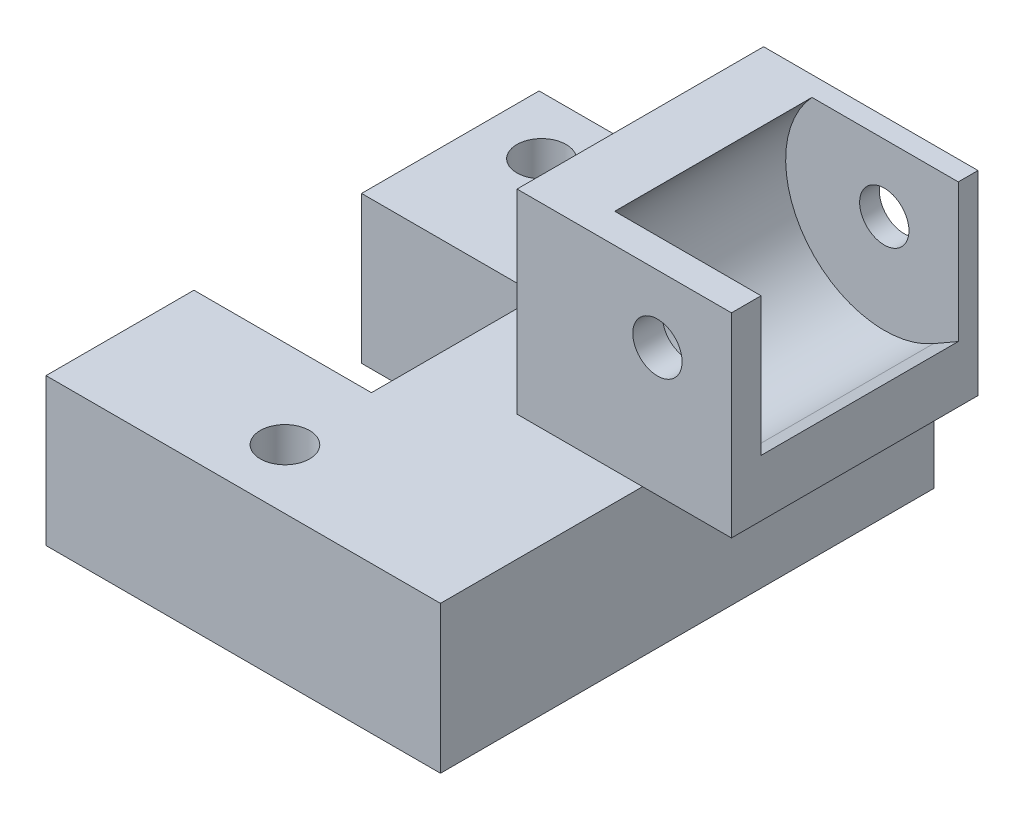
ISO-10303-21;
HEADER;
FILE_DESCRIPTION(('STEP AP214'),'2;1');
FILE_NAME('part.step','',(''),(''),'','','');
FILE_SCHEMA(('AUTOMOTIVE_DESIGN { 1 0 10303 214 1 1 1 1 }'));
ENDSEC;
DATA;
#1=APPLICATION_CONTEXT('core data for automotive mechanical design processes');
#2=APPLICATION_PROTOCOL_DEFINITION('international standard','automotive_design',2000,#1);
#3=PRODUCT_CONTEXT('',#1,'mechanical');
#4=PRODUCT('Part','Part','',(#3));
#5=PRODUCT_RELATED_PRODUCT_CATEGORY('part','',(#4));
#6=PRODUCT_DEFINITION_FORMATION('','',#4);
#7=PRODUCT_DEFINITION_CONTEXT('part definition',#1,'design');
#8=PRODUCT_DEFINITION('design','',#6,#7);
#9=PRODUCT_DEFINITION_SHAPE('','',#8);
#10=(LENGTH_UNIT() NAMED_UNIT(*) SI_UNIT(.MILLI.,.METRE.));
#11=(NAMED_UNIT(*) PLANE_ANGLE_UNIT() SI_UNIT($,.RADIAN.));
#12=(NAMED_UNIT(*) SI_UNIT($,.STERADIAN.) SOLID_ANGLE_UNIT());
#13=UNCERTAINTY_MEASURE_WITH_UNIT(LENGTH_MEASURE(1.E-05),#10,'distance_accuracy_value','');
#14=(GEOMETRIC_REPRESENTATION_CONTEXT(3) GLOBAL_UNCERTAINTY_ASSIGNED_CONTEXT((#13)) GLOBAL_UNIT_ASSIGNED_CONTEXT((#10,
#11,#12)) REPRESENTATION_CONTEXT('',''));
#15=CARTESIAN_POINT('',(0.,0.,0.));
#16=DIRECTION('',(0.,0.,1.));
#17=DIRECTION('',(1.,0.,0.));
#18=AXIS2_PLACEMENT_3D('',#15,#16,#17);
#19=CARTESIAN_POINT('',(-562.359793246241,223.218740039352,-33.6602128680418));
#20=DIRECTION('',(-1.,0.,0.));
#21=DIRECTION('',(0.,-1.,0.));
#22=AXIS2_PLACEMENT_3D('',#19,#20,#21);
#23=PLANE('',#22);
#24=DIRECTION('',(0.,1.,0.));
#25=VECTOR('',#24,1.);
#26=CARTESIAN_POINT('',(-562.359793246241,304.5714,-10.8002128680418));
#27=LINE('',#26,#25);
#28=CARTESIAN_POINT('',(-562.359793246241,304.5714,-10.8002128680418));
#29=VERTEX_POINT('',#28);
#30=CARTESIAN_POINT('',(-562.359793246241,323.525975182462,-10.8002128680418));
#31=VERTEX_POINT('',#30);
#32=EDGE_CURVE('E204',#29,#31,#27,.T.);
#33=ORIENTED_EDGE('',*,*,#32,.T.);
#34=DIRECTION('',(0.,0.,1.));
#35=VECTOR('',#34,1.);
#36=CARTESIAN_POINT('',(-562.359793246241,323.525975182462,-33.6602128680418));
#37=LINE('',#36,#35);
#38=CARTESIAN_POINT('',(-562.359793246241,323.525975182462,-33.6602128680418));
#39=VERTEX_POINT('',#38);
#40=EDGE_CURVE('E360',#39,#31,#37,.T.);
#41=ORIENTED_EDGE('',*,*,#40,.F.);
#42=DIRECTION('',(0.,1.,0.));
#43=VECTOR('',#42,1.);
#44=CARTESIAN_POINT('',(-562.359793246241,223.218740039352,-33.6602128680418));
#45=LINE('',#44,#43);
#46=CARTESIAN_POINT('',(-562.359793246241,304.5714,-33.6602128680418));
#47=VERTEX_POINT('',#46);
#48=EDGE_CURVE('E217',#47,#39,#45,.T.);
#49=ORIENTED_EDGE('',*,*,#48,.F.);
#50=DIRECTION('',(0.,0.,1.));
#51=VECTOR('',#50,1.);
#52=CARTESIAN_POINT('',(-562.359793246241,304.5714,-33.6602128680418));
#53=LINE('',#52,#51);
#54=EDGE_CURVE('E203',#47,#29,#53,.T.);
#55=ORIENTED_EDGE('',*,*,#54,.T.);
#56=EDGE_LOOP('',(#33,#41,#49,#55));
#57=FACE_BOUND('',#56,.T.);
#58=ADVANCED_FACE('F56',(#57),#23,.T.);
#59=CARTESIAN_POINT('',(-509.64503003972,340.,-27.94));
#60=DIRECTION('',(0.,0.,1.));
#61=DIRECTION('',(1.,0.,0.));
#62=AXIS2_PLACEMENT_3D('',#59,#60,#61);
#63=CYLINDRICAL_SURFACE('',#62,12.7);
#64=CARTESIAN_POINT('',(-509.64503003972,340.,-25.4000000000001));
#65=DIRECTION('',(0.,0.,-1.));
#66=DIRECTION('',(-1.,0.,0.));
#67=AXIS2_PLACEMENT_3D('',#64,#65,#66);
#68=CIRCLE('',#67,12.7);
#69=CARTESIAN_POINT('',(-503.315891549761,328.989459324133,-25.4000000000001));
#70=VERTEX_POINT('',#69);
#71=CARTESIAN_POINT('',(-518.959059009132,348.633589309028,-25.4000000000001));
#72=VERTEX_POINT('',#71);
#73=EDGE_CURVE('E264',#70,#72,#68,.T.);
#74=ORIENTED_EDGE('',*,*,#73,.T.);
#75=DIRECTION('',(0.,0.,1.));
#76=VECTOR('',#75,1.);
#77=CARTESIAN_POINT('',(-518.959059009132,348.633589309028,-27.94));
#78=LINE('',#77,#76);
#79=CARTESIAN_POINT('',(-518.959059009132,348.633589309028,0.));
#80=VERTEX_POINT('',#79);
#81=EDGE_CURVE('E60',#72,#80,#78,.T.);
#82=ORIENTED_EDGE('',*,*,#81,.T.);
#83=CARTESIAN_POINT('',(-509.64503003972,340.,0.));
#84=DIRECTION('',(0.,0.,1.));
#85=DIRECTION('',(1.,0.,0.));
#86=AXIS2_PLACEMENT_3D('',#83,#84,#85);
#87=CIRCLE('',#86,12.7);
#88=CARTESIAN_POINT('',(-503.315891549761,328.989459324133,0.));
#89=VERTEX_POINT('',#88);
#90=EDGE_CURVE('E275',#80,#89,#87,.T.);
#91=ORIENTED_EDGE('',*,*,#90,.T.);
#92=DIRECTION('',(0.,0.,1.));
#93=VECTOR('',#92,1.);
#94=CARTESIAN_POINT('',(-503.315891549761,328.989459324133,-27.94));
#95=LINE('',#94,#93);
#96=EDGE_CURVE('E65',#70,#89,#95,.T.);
#97=ORIENTED_EDGE('',*,*,#96,.F.);
#98=EDGE_LOOP('',(#74,#82,#91,#97));
#99=FACE_BOUND('',#98,.T.);
#100=ADVANCED_FACE('F58',(#99),#63,.F.);
#101=CARTESIAN_POINT('',(-267.1473205328,464.745153521614,-27.94));
#102=DIRECTION('',(-0.498357361414056,0.866971706761195,0.));
#103=DIRECTION('',(-0.866971706761195,-0.498357361414056,0.));
#104=AXIS2_PLACEMENT_3D('',#101,#102,#103);
#105=PLANE('',#104);
#106=DIRECTION('',(0.,0.,1.));
#107=VECTOR('',#106,1.);
#108=CARTESIAN_POINT('',(-500.115803520306,330.82895121783,-27.94));
#109=LINE('',#108,#107);
#110=CARTESIAN_POINT('',(-500.115803520306,330.82895121783,-25.4000000000001));
#111=VERTEX_POINT('',#110);
#112=CARTESIAN_POINT('',(-500.115803520306,330.82895121783,0.));
#113=VERTEX_POINT('',#112);
#114=EDGE_CURVE('E293',#111,#113,#109,.T.);
#115=ORIENTED_EDGE('',*,*,#114,.F.);
#116=DIRECTION('',(-0.866971706761204,-0.498357361414042,0.));
#117=VECTOR('',#116,1.);
#118=CARTESIAN_POINT('',(-500.115803520306,330.82895121783,-25.4000000000001));
#119=LINE('',#118,#117);
#120=EDGE_CURVE('E267',#111,#70,#119,.T.);
#121=ORIENTED_EDGE('',*,*,#120,.T.);
#122=ORIENTED_EDGE('',*,*,#96,.T.);
#123=DIRECTION('',(-0.866971706761195,-0.498357361414056,0.));
#124=VECTOR('',#123,1.);
#125=CARTESIAN_POINT('',(-267.1473205328,464.745153521614,0.));
#126=LINE('',#125,#124);
#127=EDGE_CURVE('E280',#113,#89,#126,.T.);
#128=ORIENTED_EDGE('',*,*,#127,.F.);
#129=EDGE_LOOP('',(#115,#121,#122,#128));
#130=FACE_BOUND('',#129,.T.);
#131=ADVANCED_FACE('F321',(#130),#105,.T.);
#132=CARTESIAN_POINT('',(-500.115803520306,0.,-27.94));
#133=DIRECTION('',(-1.,0.,0.));
#134=DIRECTION('',(0.,0.,1.));
#135=AXIS2_PLACEMENT_3D('',#132,#133,#134);
#136=PLANE('',#135);
#137=ORIENTED_EDGE('',*,*,#114,.T.);
#138=DIRECTION('',(0.,-1.,0.));
#139=VECTOR('',#138,1.);
#140=CARTESIAN_POINT('',(-500.115803520306,348.633589309028,0.));
#141=LINE('',#140,#139);
#142=CARTESIAN_POINT('',(-500.115803520306,348.633589309028,0.));
#143=VERTEX_POINT('',#142);
#144=EDGE_CURVE('E251',#143,#113,#141,.T.);
#145=ORIENTED_EDGE('',*,*,#144,.F.);
#146=DIRECTION('',(0.,0.,-1.));
#147=VECTOR('',#146,1.);
#148=CARTESIAN_POINT('',(-500.115803520306,348.633589309028,3.81));
#149=LINE('',#148,#147);
#150=CARTESIAN_POINT('',(-500.115803520306,348.633589309028,3.81));
#151=VERTEX_POINT('',#150);
#152=EDGE_CURVE('E249',#151,#143,#149,.T.);
#153=ORIENTED_EDGE('',*,*,#152,.F.);
#154=DIRECTION('',(0.,-1.,0.));
#155=VECTOR('',#154,1.);
#156=CARTESIAN_POINT('',(-500.115803520306,348.633589309028,3.81));
#157=LINE('',#156,#155);
#158=CARTESIAN_POINT('',(-500.115803520306,323.525975182462,3.81));
#159=VERTEX_POINT('',#158);
#160=EDGE_CURVE('E246',#151,#159,#157,.T.);
#161=ORIENTED_EDGE('',*,*,#160,.T.);
#162=DIRECTION('',(0.,0.,1.));
#163=VECTOR('',#162,1.);
#164=CARTESIAN_POINT('',(-500.115803520306,323.525975182462,-27.94));
#165=LINE('',#164,#163);
#166=CARTESIAN_POINT('',(-500.115803520306,323.525975182462,-27.94));
#167=VERTEX_POINT('',#166);
#168=EDGE_CURVE('E295',#167,#159,#165,.T.);
#169=ORIENTED_EDGE('',*,*,#168,.F.);
#170=DIRECTION('',(0.,-1.,0.));
#171=VECTOR('',#170,1.);
#172=CARTESIAN_POINT('',(-500.115803520306,0.,-27.94));
#173=LINE('',#172,#171);
#174=CARTESIAN_POINT('',(-500.115803520306,348.633589309028,-27.94));
#175=VERTEX_POINT('',#174);
#176=EDGE_CURVE('E286',#175,#167,#173,.T.);
#177=ORIENTED_EDGE('',*,*,#176,.F.);
#178=DIRECTION('',(0.,0.,1.));
#179=VECTOR('',#178,1.);
#180=CARTESIAN_POINT('',(-500.115803520306,348.633589309028,-58.7500721267847));
#181=LINE('',#180,#179);
#182=CARTESIAN_POINT('',(-500.115803520306,348.633589309028,-25.4000000000001));
#183=VERTEX_POINT('',#182);
#184=EDGE_CURVE('E260',#175,#183,#181,.T.);
#185=ORIENTED_EDGE('',*,*,#184,.T.);
#186=DIRECTION('',(0.,-1.,0.));
#187=VECTOR('',#186,1.);
#188=CARTESIAN_POINT('',(-500.115803520306,330.82895121783,-25.4000000000001));
#189=LINE('',#188,#187);
#190=EDGE_CURVE('E257',#183,#111,#189,.T.);
#191=ORIENTED_EDGE('',*,*,#190,.T.);
#192=EDGE_LOOP('',(#137,#145,#153,#161,#169,#177,#185,#191));
#193=FACE_BOUND('',#192,.T.);
#194=ADVANCED_FACE('F316',(#193),#136,.F.);
#195=CARTESIAN_POINT('',(0.,323.525975182462,-27.94));
#196=DIRECTION('',(0.,1.,0.));
#197=DIRECTION('',(0.,0.,1.));
#198=AXIS2_PLACEMENT_3D('',#195,#196,#197);
#199=PLANE('',#198);
#200=DIRECTION('',(-1.,0.,0.));
#201=VECTOR('',#200,1.);
#202=CARTESIAN_POINT('',(-500.115803520306,323.525975182462,3.81));
#203=LINE('',#202,#201);
#204=CARTESIAN_POINT('',(-511.559800437477,323.525975182462,3.81000000000003));
#205=VERTEX_POINT('',#204);
#206=EDGE_CURVE('E236',#159,#205,#203,.T.);
#207=ORIENTED_EDGE('',*,*,#206,.T.);
#208=DIRECTION('',(-2.76269463312672E-07,0.,-0.999999999999962));
#209=VECTOR('',#208,1.);
#210=CARTESIAN_POINT('',(-511.55981080102,323.525975182462,-33.7024451444806));
#211=LINE('',#210,#209);
#212=CARTESIAN_POINT('',(-511.559809209032,323.525975182462,-27.94));
#213=VERTEX_POINT('',#212);
#214=EDGE_CURVE('E12',#205,#213,#211,.T.);
#215=ORIENTED_EDGE('',*,*,#214,.T.);
#216=DIRECTION('',(-1.,0.,0.));
#217=VECTOR('',#216,1.);
#218=CARTESIAN_POINT('',(0.,323.525975182462,-27.94));
#219=LINE('',#218,#217);
#220=EDGE_CURVE('E283',#167,#213,#219,.T.);
#221=ORIENTED_EDGE('',*,*,#220,.F.);
#222=ORIENTED_EDGE('',*,*,#168,.T.);
#223=EDGE_LOOP('',(#207,#215,#221,#222));
#224=FACE_BOUND('',#223,.T.);
#225=ADVANCED_FACE('F342',(#224),#199,.F.);
#226=CARTESIAN_POINT('',(-527.727560082314,0.,-27.94));
#227=DIRECTION('',(1.,0.,0.));
#228=DIRECTION('',(0.,0.,-1.));
#229=AXIS2_PLACEMENT_3D('',#226,#227,#228);
#230=PLANE('',#229);
#231=DIRECTION('',(0.,0.,1.));
#232=VECTOR('',#231,1.);
#233=CARTESIAN_POINT('',(-527.727560082314,323.525975182462,-27.94));
#234=LINE('',#233,#232);
#235=CARTESIAN_POINT('',(-527.727560082314,323.525975182462,-27.94));
#236=VERTEX_POINT('',#235);
#237=CARTESIAN_POINT('',(-527.727560082314,323.525975182462,3.81));
#238=VERTEX_POINT('',#237);
#239=EDGE_CURVE('E297',#236,#238,#234,.T.);
#240=ORIENTED_EDGE('',*,*,#239,.T.);
#241=DIRECTION('',(0.,1.,0.));
#242=VECTOR('',#241,1.);
#243=CARTESIAN_POINT('',(-527.727560082314,323.525975182462,3.81));
#244=LINE('',#243,#242);
#245=CARTESIAN_POINT('',(-527.727560082314,348.633589309028,3.81));
#246=VERTEX_POINT('',#245);
#247=EDGE_CURVE('E239',#238,#246,#244,.T.);
#248=ORIENTED_EDGE('',*,*,#247,.T.);
#249=DIRECTION('',(0.,0.,1.));
#250=VECTOR('',#249,1.);
#251=CARTESIAN_POINT('',(-527.727560082314,348.633589309028,-27.94));
#252=LINE('',#251,#250);
#253=CARTESIAN_POINT('',(-527.727560082314,348.633589309028,-27.94));
#254=VERTEX_POINT('',#253);
#255=EDGE_CURVE('E299',#254,#246,#252,.T.);
#256=ORIENTED_EDGE('',*,*,#255,.F.);
#257=DIRECTION('',(0.,1.,0.));
#258=VECTOR('',#257,1.);
#259=CARTESIAN_POINT('',(-527.727560082314,0.,-27.94));
#260=LINE('',#259,#258);
#261=EDGE_CURVE('E279',#236,#254,#260,.T.);
#262=ORIENTED_EDGE('',*,*,#261,.F.);
#263=EDGE_LOOP('',(#240,#248,#256,#262));
#264=FACE_BOUND('',#263,.T.);
#265=ADVANCED_FACE('F334',(#264),#230,.F.);
#266=CARTESIAN_POINT('',(-7.00898976020188E-13,348.633589309029,-27.94));
#267=DIRECTION('',(0.,-1.,0.));
#268=DIRECTION('',(1.,0.,0.));
#269=AXIS2_PLACEMENT_3D('',#266,#267,#268);
#270=PLANE('',#269);
#271=ORIENTED_EDGE('',*,*,#255,.T.);
#272=DIRECTION('',(1.,0.,0.));
#273=VECTOR('',#272,1.);
#274=CARTESIAN_POINT('',(-527.727560082314,348.633589309028,3.81));
#275=LINE('',#274,#273);
#276=EDGE_CURVE('E243',#246,#151,#275,.T.);
#277=ORIENTED_EDGE('',*,*,#276,.T.);
#278=ORIENTED_EDGE('',*,*,#152,.T.);
#279=DIRECTION('',(1.,0.,0.));
#280=VECTOR('',#279,1.);
#281=CARTESIAN_POINT('',(-527.727560082314,348.633589309028,0.));
#282=LINE('',#281,#280);
#283=EDGE_CURVE('E231',#80,#143,#282,.T.);
#284=ORIENTED_EDGE('',*,*,#283,.F.);
#285=ORIENTED_EDGE('',*,*,#81,.F.);
#286=DIRECTION('',(1.,0.,0.));
#287=VECTOR('',#286,1.);
#288=CARTESIAN_POINT('',(-500.115803520306,348.633589309028,-25.4000000000001));
#289=LINE('',#288,#287);
#290=EDGE_CURVE('E261',#72,#183,#289,.T.);
#291=ORIENTED_EDGE('',*,*,#290,.T.);
#292=ORIENTED_EDGE('',*,*,#184,.F.);
#293=DIRECTION('',(1.,0.,0.));
#294=VECTOR('',#293,1.);
#295=CARTESIAN_POINT('',(-7.00898976020188E-13,348.633589309029,-27.94));
#296=LINE('',#295,#294);
#297=EDGE_CURVE('E276',#254,#175,#296,.T.);
#298=ORIENTED_EDGE('',*,*,#297,.F.);
#299=EDGE_LOOP('',(#271,#277,#278,#284,#285,#291,#292,#298));
#300=FACE_BOUND('',#299,.T.);
#301=ADVANCED_FACE('F312',(#300),#270,.F.);
#302=CARTESIAN_POINT('',(0.,0.,-27.94));
#303=DIRECTION('',(0.,0.,1.));
#304=DIRECTION('',(1.,0.,0.));
#305=AXIS2_PLACEMENT_3D('',#302,#303,#304);
#306=PLANE('',#305);
#307=ORIENTED_EDGE('',*,*,#297,.T.);
#308=ORIENTED_EDGE('',*,*,#176,.T.);
#309=ORIENTED_EDGE('',*,*,#220,.T.);
#310=EDGE_CURVE('E282',#213,#236,#219,.T.);
#311=ORIENTED_EDGE('',*,*,#310,.T.);
#312=ORIENTED_EDGE('',*,*,#261,.T.);
#313=EDGE_LOOP('',(#307,#308,#309,#311,#312));
#314=FACE_BOUND('',#313,.T.);
#315=CARTESIAN_POINT('',(-509.64503003972,340.,-27.94));
#316=DIRECTION('',(0.,0.,1.));
#317=DIRECTION('',(1.,0.,0.));
#318=AXIS2_PLACEMENT_3D('',#315,#316,#317);
#319=CIRCLE('',#318,3.1750000000002);
#320=CARTESIAN_POINT('',(-506.47003003972,340.,-27.94));
#321=VERTEX_POINT('',#320);
#322=EDGE_CURVE('E259',#321,#321,#319,.T.);
#323=ORIENTED_EDGE('',*,*,#322,.T.);
#324=EDGE_LOOP('',(#323));
#325=FACE_BOUND('',#324,.T.);
#326=ADVANCED_FACE('F329',(#314,#325),#306,.F.);
#327=CARTESIAN_POINT('',(-509.64503003972,340.,-25.4000000000001));
#328=DIRECTION('',(0.,0.,-1.));
#329=DIRECTION('',(-1.,0.,0.));
#330=AXIS2_PLACEMENT_3D('',#327,#328,#329);
#331=PLANE('',#330);
#332=ORIENTED_EDGE('',*,*,#120,.F.);
#333=ORIENTED_EDGE('',*,*,#190,.F.);
#334=ORIENTED_EDGE('',*,*,#290,.F.);
#335=ORIENTED_EDGE('',*,*,#73,.F.);
#336=EDGE_LOOP('',(#332,#333,#334,#335));
#337=FACE_BOUND('',#336,.T.);
#338=CARTESIAN_POINT('',(-509.64503003972,340.,-25.4000000000001));
#339=DIRECTION('',(0.,0.,-1.));
#340=DIRECTION('',(-1.,0.,0.));
#341=AXIS2_PLACEMENT_3D('',#338,#339,#340);
#342=CIRCLE('',#341,3.1750000000002);
#343=CARTESIAN_POINT('',(-512.82003003972,340.,-25.4000000000001));
#344=VERTEX_POINT('',#343);
#345=EDGE_CURVE('E256',#344,#344,#342,.T.);
#346=ORIENTED_EDGE('',*,*,#345,.T.);
#347=EDGE_LOOP('',(#346));
#348=FACE_BOUND('',#347,.T.);
#349=ADVANCED_FACE('F323',(#337,#348),#331,.F.);
#350=CARTESIAN_POINT('',(-509.64503003972,340.,-58.7500721267847));
#351=DIRECTION('',(0.,0.,1.));
#352=DIRECTION('',(1.,0.,0.));
#353=AXIS2_PLACEMENT_3D('',#350,#351,#352);
#354=CYLINDRICAL_SURFACE('',#353,3.1750000000002);
#355=ORIENTED_EDGE('',*,*,#322,.F.);
#356=EDGE_LOOP('',(#355));
#357=FACE_BOUND('',#356,.T.);
#358=ORIENTED_EDGE('',*,*,#345,.F.);
#359=EDGE_LOOP('',(#358));
#360=FACE_BOUND('',#359,.T.);
#361=ADVANCED_FACE('F413',(#357,#360),#354,.F.);
#362=CARTESIAN_POINT('',(0.,0.,0.));
#363=DIRECTION('',(0.,0.,-1.));
#364=DIRECTION('',(-1.,0.,0.));
#365=AXIS2_PLACEMENT_3D('',#362,#363,#364);
#366=PLANE('',#365);
#367=CARTESIAN_POINT('',(-509.64503003972,340.,0.));
#368=DIRECTION('',(0.,0.,1.));
#369=DIRECTION('',(1.,0.,0.));
#370=AXIS2_PLACEMENT_3D('',#367,#368,#369);
#371=CIRCLE('',#370,3.17500000000009);
#372=CARTESIAN_POINT('',(-506.47003003972,340.,0.));
#373=VERTEX_POINT('',#372);
#374=EDGE_CURVE('E232',#373,#373,#371,.T.);
#375=ORIENTED_EDGE('',*,*,#374,.T.);
#376=EDGE_LOOP('',(#375));
#377=FACE_BOUND('',#376,.T.);
#378=ORIENTED_EDGE('',*,*,#90,.F.);
#379=ORIENTED_EDGE('',*,*,#283,.T.);
#380=ORIENTED_EDGE('',*,*,#144,.T.);
#381=ORIENTED_EDGE('',*,*,#127,.T.);
#382=EDGE_LOOP('',(#378,#379,#380,#381));
#383=FACE_BOUND('',#382,.T.);
#384=ADVANCED_FACE('F310',(#377,#383),#366,.T.);
#385=CARTESIAN_POINT('',(0.,0.,3.81));
#386=DIRECTION('',(0.,0.,-1.));
#387=DIRECTION('',(-1.,0.,0.));
#388=AXIS2_PLACEMENT_3D('',#385,#386,#387);
#389=PLANE('',#388);
#390=ORIENTED_EDGE('',*,*,#206,.F.);
#391=ORIENTED_EDGE('',*,*,#160,.F.);
#392=ORIENTED_EDGE('',*,*,#276,.F.);
#393=ORIENTED_EDGE('',*,*,#247,.F.);
#394=EDGE_CURVE('E240',#205,#238,#203,.T.);
#395=ORIENTED_EDGE('',*,*,#394,.F.);
#396=EDGE_LOOP('',(#390,#391,#392,#393,#395));
#397=FACE_BOUND('',#396,.T.);
#398=CARTESIAN_POINT('',(-509.64503003972,340.,3.81));
#399=DIRECTION('',(0.,0.,1.));
#400=DIRECTION('',(1.,0.,0.));
#401=AXIS2_PLACEMENT_3D('',#398,#399,#400);
#402=CIRCLE('',#401,3.17500000000009);
#403=CARTESIAN_POINT('',(-506.47003003972,340.,3.81));
#404=VERTEX_POINT('',#403);
#405=EDGE_CURVE('E228',#404,#404,#402,.T.);
#406=ORIENTED_EDGE('',*,*,#405,.F.);
#407=EDGE_LOOP('',(#406));
#408=FACE_BOUND('',#407,.T.);
#409=ADVANCED_FACE('F339',(#397,#408),#389,.F.);
#410=CARTESIAN_POINT('',(-509.64503003972,340.,3.81));
#411=DIRECTION('',(0.,0.,-1.));
#412=DIRECTION('',(-1.,0.,0.));
#413=AXIS2_PLACEMENT_3D('',#410,#411,#412);
#414=CYLINDRICAL_SURFACE('',#413,3.17500000000009);
#415=ORIENTED_EDGE('',*,*,#405,.T.);
#416=EDGE_LOOP('',(#415));
#417=FACE_BOUND('',#416,.T.);
#418=ORIENTED_EDGE('',*,*,#374,.F.);
#419=EDGE_LOOP('',(#418));
#420=FACE_BOUND('',#419,.T.);
#421=ADVANCED_FACE('F396',(#417,#420),#414,.F.);
#422=DIRECTION('',(0.,1.,0.));
#423=VECTOR('',#422,1.);
#424=CARTESIAN_POINT('',(-562.359793246241,304.5714,10.7897871319582));
#425=LINE('',#424,#423);
#426=CARTESIAN_POINT('',(-562.359793246241,304.5714,10.7897871319582));
#427=VERTEX_POINT('',#426);
#428=CARTESIAN_POINT('',(-562.359793246241,323.525975182462,10.7897871319582));
#429=VERTEX_POINT('',#428);
#430=EDGE_CURVE('E181',#427,#429,#425,.T.);
#431=ORIENTED_EDGE('',*,*,#430,.F.);
#432=CARTESIAN_POINT('',(-562.359793246241,304.5714,29.8397871319582));
#433=VERTEX_POINT('',#432);
#434=EDGE_CURVE('E192',#427,#433,#53,.T.);
#435=ORIENTED_EDGE('',*,*,#434,.T.);
#436=DIRECTION('',(0.,1.,0.));
#437=VECTOR('',#436,1.);
#438=CARTESIAN_POINT('',(-562.359793246241,223.218740039352,29.8397871319582));
#439=LINE('',#438,#437);
#440=CARTESIAN_POINT('',(-562.359793246241,323.525975182462,29.8397871319582));
#441=VERTEX_POINT('',#440);
#442=EDGE_CURVE('E207',#433,#441,#439,.T.);
#443=ORIENTED_EDGE('',*,*,#442,.T.);
#444=EDGE_CURVE('E194',#429,#441,#37,.T.);
#445=ORIENTED_EDGE('',*,*,#444,.F.);
#446=EDGE_LOOP('',(#431,#435,#443,#445));
#447=FACE_BOUND('',#446,.T.);
#448=ADVANCED_FACE('F190',(#447),#23,.T.);
#449=CARTESIAN_POINT('',(-562.359793246241,223.218740039352,-33.6602128680418));
#450=DIRECTION('',(-0.000831344024384845,0.,-0.999999654433497));
#451=DIRECTION('',(-0.999999654433497,0.,0.000831344024384845));
#452=AXIS2_PLACEMENT_3D('',#449,#450,#451);
#453=PLANE('',#452);
#454=DIRECTION('',(0.,1.,0.));
#455=VECTOR('',#454,1.);
#456=CARTESIAN_POINT('',(-511.55981080102,223.218740039352,-33.7024451444805));
#457=LINE('',#456,#455);
#458=CARTESIAN_POINT('',(-511.55981080102,304.5714,-33.7024451444806));
#459=VERTEX_POINT('',#458);
#460=CARTESIAN_POINT('',(-511.55981080102,323.525975182462,-33.7024451444806));
#461=VERTEX_POINT('',#460);
#462=EDGE_CURVE('E221',#459,#461,#457,.T.);
#463=ORIENTED_EDGE('',*,*,#462,.F.);
#464=DIRECTION('',(-0.999999654433497,0.,0.000831344024384845));
#465=VECTOR('',#464,1.);
#466=CARTESIAN_POINT('',(-562.359793246241,304.5714,-33.6602128680418));
#467=LINE('',#466,#465);
#468=EDGE_CURVE('E214',#459,#47,#467,.T.);
#469=ORIENTED_EDGE('',*,*,#468,.T.);
#470=ORIENTED_EDGE('',*,*,#48,.T.);
#471=DIRECTION('',(-0.999999654433497,0.,0.000831344024384845));
#472=VECTOR('',#471,1.);
#473=CARTESIAN_POINT('',(-562.359793246241,323.525975182462,-33.6602128680418));
#474=LINE('',#473,#472);
#475=EDGE_CURVE('E354',#461,#39,#474,.T.);
#476=ORIENTED_EDGE('',*,*,#475,.F.);
#477=EDGE_LOOP('',(#463,#469,#470,#476));
#478=FACE_BOUND('',#477,.T.);
#479=ADVANCED_FACE('F395',(#478),#453,.T.);
#480=CARTESIAN_POINT('',(-511.55981080102,223.218740039352,-33.7024451444805));
#481=DIRECTION('',(0.999999999999962,0.,-2.76269463312672E-07));
#482=DIRECTION('',(-2.76269463312672E-07,0.,-0.999999999999962));
#483=AXIS2_PLACEMENT_3D('',#480,#481,#482);
#484=PLANE('',#483);
#485=DIRECTION('',(0.,1.,0.));
#486=VECTOR('',#485,1.);
#487=CARTESIAN_POINT('',(-511.559793246241,223.218740039352,29.8397871319582));
#488=LINE('',#487,#486);
#489=CARTESIAN_POINT('',(-511.559793246241,304.5714,29.8397871319582));
#490=VERTEX_POINT('',#489);
#491=CARTESIAN_POINT('',(-511.559793246241,323.525975182462,29.8397871319582));
#492=VERTEX_POINT('',#491);
#493=EDGE_CURVE('E224',#490,#492,#488,.T.);
#494=ORIENTED_EDGE('',*,*,#493,.F.);
#495=DIRECTION('',(-2.76269463312672E-07,0.,-0.999999999999962));
#496=VECTOR('',#495,1.);
#497=CARTESIAN_POINT('',(-511.55981080102,304.5714,-33.7024451444806));
#498=LINE('',#497,#496);
#499=EDGE_CURVE('E218',#490,#459,#498,.T.);
#500=ORIENTED_EDGE('',*,*,#499,.T.);
#501=ORIENTED_EDGE('',*,*,#462,.T.);
#502=EDGE_CURVE('E68',#213,#461,#211,.T.);
#503=ORIENTED_EDGE('',*,*,#502,.F.);
#504=ORIENTED_EDGE('',*,*,#214,.F.);
#505=EDGE_CURVE('E67',#492,#205,#211,.T.);
#506=ORIENTED_EDGE('',*,*,#505,.F.);
#507=EDGE_LOOP('',(#494,#500,#501,#503,#504,#506));
#508=FACE_BOUND('',#507,.T.);
#509=ADVANCED_FACE('F346',(#508),#484,.T.);
#510=CARTESIAN_POINT('',(-562.359793246241,223.218740039352,29.8397871319582));
#511=DIRECTION('',(0.,0.,1.));
#512=DIRECTION('',(0.,-1.,0.));
#513=AXIS2_PLACEMENT_3D('',#510,#511,#512);
#514=PLANE('',#513);
#515=ORIENTED_EDGE('',*,*,#442,.F.);
#516=DIRECTION('',(1.,0.,0.));
#517=VECTOR('',#516,1.);
#518=CARTESIAN_POINT('',(-562.359793246241,304.5714,29.8397871319582));
#519=LINE('',#518,#517);
#520=EDGE_CURVE('E201',#433,#490,#519,.T.);
#521=ORIENTED_EDGE('',*,*,#520,.T.);
#522=ORIENTED_EDGE('',*,*,#493,.T.);
#523=DIRECTION('',(1.,0.,0.));
#524=VECTOR('',#523,1.);
#525=CARTESIAN_POINT('',(-562.359793246241,323.525975182462,29.8397871319582));
#526=LINE('',#525,#524);
#527=EDGE_CURVE('E353',#441,#492,#526,.T.);
#528=ORIENTED_EDGE('',*,*,#527,.F.);
#529=EDGE_LOOP('',(#515,#521,#522,#528));
#530=FACE_BOUND('',#529,.T.);
#531=ADVANCED_FACE('F384',(#530),#514,.T.);
#532=CARTESIAN_POINT('',(-539.269132339574,223.218740039352,22.1596399352954));
#533=DIRECTION('',(0.,1.,0.));
#534=DIRECTION('',(0.,0.,1.));
#535=AXIS2_PLACEMENT_3D('',#532,#533,#534);
#536=CYLINDRICAL_SURFACE('',#535,3.17500000000008);
#537=CARTESIAN_POINT('',(-539.269132339574,323.525975182462,22.1596399352954));
#538=DIRECTION('',(0.,1.,0.));
#539=DIRECTION('',(0.,0.,1.));
#540=AXIS2_PLACEMENT_3D('',#537,#538,#539);
#541=CIRCLE('',#540,3.17500000000008);
#542=CARTESIAN_POINT('',(-539.269132339574,323.525975182462,25.3346399352955));
#543=VERTEX_POINT('',#542);
#544=EDGE_CURVE('E226',#543,#543,#541,.T.);
#545=ORIENTED_EDGE('',*,*,#544,.T.);
#546=EDGE_LOOP('',(#545));
#547=FACE_BOUND('',#546,.T.);
#548=CARTESIAN_POINT('',(-539.269132339574,304.5714,22.1596399352954));
#549=DIRECTION('',(0.,-1.,0.));
#550=DIRECTION('',(0.,0.,-1.));
#551=AXIS2_PLACEMENT_3D('',#548,#549,#550);
#552=CIRCLE('',#551,3.17500000000008);
#553=CARTESIAN_POINT('',(-539.269132339574,304.5714,18.9846399352953));
#554=VERTEX_POINT('',#553);
#555=EDGE_CURVE('E235',#554,#554,#552,.F.);
#556=ORIENTED_EDGE('',*,*,#555,.F.);
#557=EDGE_LOOP('',(#556));
#558=FACE_BOUND('',#557,.T.);
#559=ADVANCED_FACE('F375',(#547,#558),#536,.F.);
#560=CARTESIAN_POINT('',(-554.645069673997,223.218740039352,-26.2575114791356));
#561=DIRECTION('',(0.,1.,0.));
#562=DIRECTION('',(0.,0.,1.));
#563=AXIS2_PLACEMENT_3D('',#560,#561,#562);
#564=CYLINDRICAL_SURFACE('',#563,3.17500000000008);
#565=CARTESIAN_POINT('',(-554.645069673997,323.525975182462,-26.2575114791357));
#566=DIRECTION('',(0.,1.,0.));
#567=DIRECTION('',(0.,0.,1.));
#568=AXIS2_PLACEMENT_3D('',#565,#566,#567);
#569=CIRCLE('',#568,3.17500000000008);
#570=CARTESIAN_POINT('',(-554.645069673997,323.525975182462,-23.0825114791356));
#571=VERTEX_POINT('',#570);
#572=EDGE_CURVE('E365',#571,#571,#569,.T.);
#573=ORIENTED_EDGE('',*,*,#572,.T.);
#574=EDGE_LOOP('',(#573));
#575=FACE_BOUND('',#574,.T.);
#576=CARTESIAN_POINT('',(-554.645069673997,304.5714,-26.2575114791357));
#577=DIRECTION('',(0.,-1.,0.));
#578=DIRECTION('',(0.,0.,-1.));
#579=AXIS2_PLACEMENT_3D('',#576,#577,#578);
#580=CIRCLE('',#579,3.17500000000008);
#581=CARTESIAN_POINT('',(-554.645069673997,304.5714,-29.4325114791357));
#582=VERTEX_POINT('',#581);
#583=EDGE_CURVE('E356',#582,#582,#580,.F.);
#584=ORIENTED_EDGE('',*,*,#583,.F.);
#585=EDGE_LOOP('',(#584));
#586=FACE_BOUND('',#585,.T.);
#587=ADVANCED_FACE('F373',(#575,#586),#564,.F.);
#588=CARTESIAN_POINT('',(0.,323.525975182462,0.));
#589=DIRECTION('',(0.,1.,0.));
#590=DIRECTION('',(0.,0.,1.));
#591=AXIS2_PLACEMENT_3D('',#588,#589,#590);
#592=PLANE('',#591);
#593=DIRECTION('',(-1.,0.,0.));
#594=VECTOR('',#593,1.);
#595=CARTESIAN_POINT('',(-562.359793246241,323.525975182462,-10.8002128680418));
#596=LINE('',#595,#594);
#597=CARTESIAN_POINT('',(-539.499793246241,323.525975182462,-10.8002128680418));
#598=VERTEX_POINT('',#597);
#599=EDGE_CURVE('E186',#598,#31,#596,.T.);
#600=ORIENTED_EDGE('',*,*,#599,.F.);
#601=DIRECTION('',(0.,0.,-1.));
#602=VECTOR('',#601,1.);
#603=CARTESIAN_POINT('',(-539.499793246241,323.525975182462,-10.8002128680418));
#604=LINE('',#603,#602);
#605=CARTESIAN_POINT('',(-539.499793246241,323.525975182462,10.7897871319582));
#606=VERTEX_POINT('',#605);
#607=EDGE_CURVE('E537',#606,#598,#604,.T.);
#608=ORIENTED_EDGE('',*,*,#607,.F.);
#609=DIRECTION('',(1.,0.,0.));
#610=VECTOR('',#609,1.);
#611=CARTESIAN_POINT('',(-539.499793246241,323.525975182462,10.7897871319582));
#612=LINE('',#611,#610);
#613=EDGE_CURVE('E539',#429,#606,#612,.T.);
#614=ORIENTED_EDGE('',*,*,#613,.F.);
#615=ORIENTED_EDGE('',*,*,#444,.T.);
#616=ORIENTED_EDGE('',*,*,#527,.T.);
#617=ORIENTED_EDGE('',*,*,#505,.T.);
#618=ORIENTED_EDGE('',*,*,#394,.T.);
#619=ORIENTED_EDGE('',*,*,#239,.F.);
#620=ORIENTED_EDGE('',*,*,#310,.F.);
#621=ORIENTED_EDGE('',*,*,#502,.T.);
#622=ORIENTED_EDGE('',*,*,#475,.T.);
#623=ORIENTED_EDGE('',*,*,#40,.T.);
#624=EDGE_LOOP('',(#600,#608,#614,#615,#616,#617,#618,#619,#620,#621,#622,#623));
#625=FACE_BOUND('',#624,.T.);
#626=ORIENTED_EDGE('',*,*,#572,.F.);
#627=EDGE_LOOP('',(#626));
#628=FACE_BOUND('',#627,.T.);
#629=ORIENTED_EDGE('',*,*,#544,.F.);
#630=EDGE_LOOP('',(#629));
#631=FACE_BOUND('',#630,.T.);
#632=ADVANCED_FACE('F350',(#625,#628,#631),#592,.T.);
#633=CARTESIAN_POINT('',(-539.269132339574,304.5714,22.1596399352961));
#634=DIRECTION('',(0.,-1.,0.));
#635=DIRECTION('',(-0.267897982037664,0.,0.96344728512781));
#636=AXIS2_PLACEMENT_3D('',#633,#634,#635);
#637=PLANE('',#636);
#638=DIRECTION('',(-1.,0.,0.));
#639=VECTOR('',#638,1.);
#640=CARTESIAN_POINT('',(-562.359793246241,304.5714,-10.8002128680418));
#641=LINE('',#640,#639);
#642=CARTESIAN_POINT('',(-539.499793246241,304.5714,-10.8002128680418));
#643=VERTEX_POINT('',#642);
#644=EDGE_CURVE('E195',#643,#29,#641,.T.);
#645=ORIENTED_EDGE('',*,*,#644,.T.);
#646=ORIENTED_EDGE('',*,*,#54,.F.);
#647=ORIENTED_EDGE('',*,*,#468,.F.);
#648=ORIENTED_EDGE('',*,*,#499,.F.);
#649=ORIENTED_EDGE('',*,*,#520,.F.);
#650=ORIENTED_EDGE('',*,*,#434,.F.);
#651=DIRECTION('',(1.,0.,0.));
#652=VECTOR('',#651,1.);
#653=CARTESIAN_POINT('',(-539.499793246241,304.5714,10.7897871319582));
#654=LINE('',#653,#652);
#655=CARTESIAN_POINT('',(-539.499793246241,304.5714,10.7897871319582));
#656=VERTEX_POINT('',#655);
#657=EDGE_CURVE('E177',#427,#656,#654,.T.);
#658=ORIENTED_EDGE('',*,*,#657,.T.);
#659=DIRECTION('',(0.,0.,-1.));
#660=VECTOR('',#659,1.);
#661=CARTESIAN_POINT('',(-539.499793246241,304.5714,-10.8002128680418));
#662=LINE('',#661,#660);
#663=EDGE_CURVE('E75',#656,#643,#662,.T.);
#664=ORIENTED_EDGE('',*,*,#663,.T.);
#665=EDGE_LOOP('',(#645,#646,#647,#648,#649,#650,#658,#664));
#666=FACE_BOUND('',#665,.T.);
#667=ORIENTED_EDGE('',*,*,#583,.T.);
#668=EDGE_LOOP('',(#667));
#669=FACE_BOUND('',#668,.T.);
#670=ORIENTED_EDGE('',*,*,#555,.T.);
#671=EDGE_LOOP('',(#670));
#672=FACE_BOUND('',#671,.T.);
#673=ADVANCED_FACE('F198',(#666,#669,#672),#637,.T.);
#674=CARTESIAN_POINT('',(-562.359793246241,304.5714,-10.8002128680418));
#675=DIRECTION('',(0.,0.,-1.));
#676=DIRECTION('',(-1.,0.,0.));
#677=AXIS2_PLACEMENT_3D('',#674,#675,#676);
#678=PLANE('',#677);
#679=ORIENTED_EDGE('',*,*,#599,.T.);
#680=ORIENTED_EDGE('',*,*,#32,.F.);
#681=ORIENTED_EDGE('',*,*,#644,.F.);
#682=DIRECTION('',(0.,1.,0.));
#683=VECTOR('',#682,1.);
#684=CARTESIAN_POINT('',(-539.499793246241,304.5714,-10.8002128680418));
#685=LINE('',#684,#683);
#686=EDGE_CURVE('E209',#643,#598,#685,.T.);
#687=ORIENTED_EDGE('',*,*,#686,.T.);
#688=EDGE_LOOP('',(#679,#680,#681,#687));
#689=FACE_BOUND('',#688,.T.);
#690=ADVANCED_FACE('F503',(#689),#678,.F.);
#691=CARTESIAN_POINT('',(-539.499793246241,304.5714,-10.8002128680418));
#692=DIRECTION('',(1.,0.,0.));
#693=DIRECTION('',(0.,0.,-1.));
#694=AXIS2_PLACEMENT_3D('',#691,#692,#693);
#695=PLANE('',#694);
#696=ORIENTED_EDGE('',*,*,#607,.T.);
#697=ORIENTED_EDGE('',*,*,#686,.F.);
#698=ORIENTED_EDGE('',*,*,#663,.F.);
#699=DIRECTION('',(0.,1.,0.));
#700=VECTOR('',#699,1.);
#701=CARTESIAN_POINT('',(-539.499793246241,304.5714,10.7897871319582));
#702=LINE('',#701,#700);
#703=EDGE_CURVE('E183',#656,#606,#702,.T.);
#704=ORIENTED_EDGE('',*,*,#703,.T.);
#705=EDGE_LOOP('',(#696,#697,#698,#704));
#706=FACE_BOUND('',#705,.T.);
#707=ADVANCED_FACE('F515',(#706),#695,.F.);
#708=CARTESIAN_POINT('',(-539.499793246241,304.5714,10.7897871319582));
#709=DIRECTION('',(0.,0.,1.));
#710=DIRECTION('',(1.,0.,0.));
#711=AXIS2_PLACEMENT_3D('',#708,#709,#710);
#712=PLANE('',#711);
#713=ORIENTED_EDGE('',*,*,#613,.T.);
#714=ORIENTED_EDGE('',*,*,#703,.F.);
#715=ORIENTED_EDGE('',*,*,#657,.F.);
#716=ORIENTED_EDGE('',*,*,#430,.T.);
#717=EDGE_LOOP('',(#713,#714,#715,#716));
#718=FACE_BOUND('',#717,.T.);
#719=ADVANCED_FACE('F180',(#718),#712,.F.);
#720=CLOSED_SHELL('',(#58,#100,#131,#194,#225,#265,#301,#326,#349,#361,#384,#409,#421,#448,#479,
#509,#531,#559,#587,#632,#673,#690,#707,#719));
#721=MANIFOLD_SOLID_BREP('B2',#720);
#722=ADVANCED_BREP_SHAPE_REPRESENTATION('',(#18,#721),#14);
#723=SHAPE_DEFINITION_REPRESENTATION(#9,#722);
ENDSEC;
END-ISO-10303-21;
